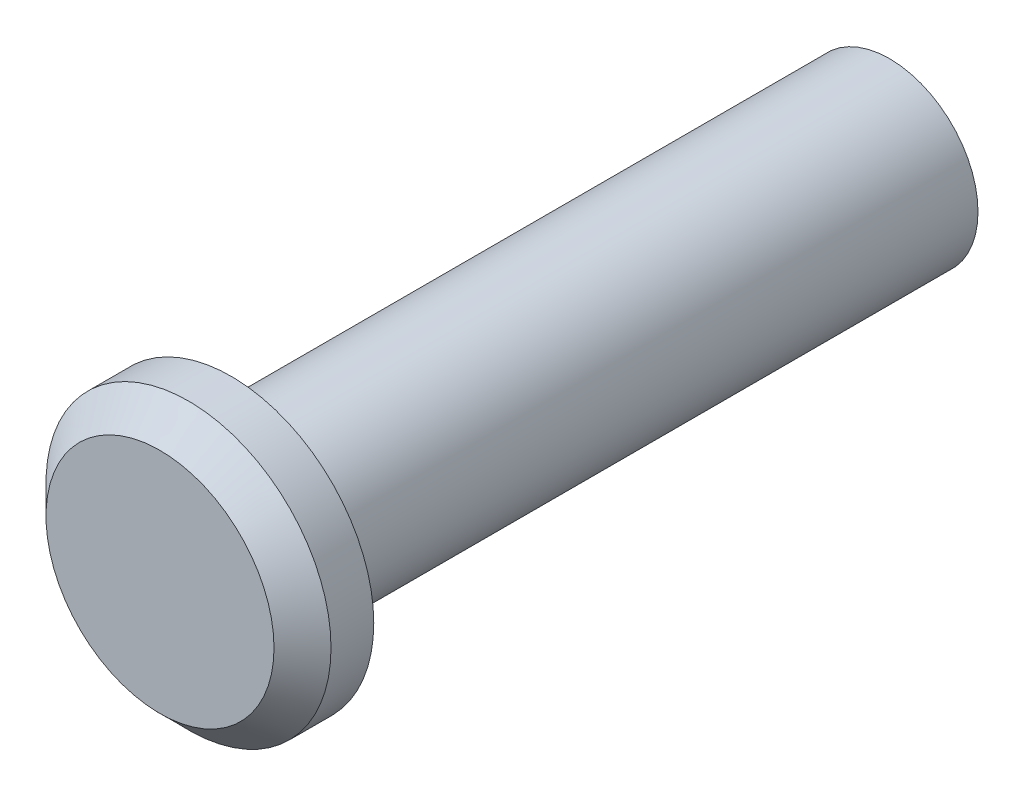
ISO-10303-21;
HEADER;
FILE_DESCRIPTION(('STEP AP214'),'2;1');
FILE_NAME('part.step','',(''),(''),'','','');
FILE_SCHEMA(('AUTOMOTIVE_DESIGN { 1 0 10303 214 1 1 1 1 }'));
ENDSEC;
DATA;
#1=APPLICATION_CONTEXT('core data for automotive mechanical design processes');
#2=APPLICATION_PROTOCOL_DEFINITION('international standard','automotive_design',2000,#1);
#3=PRODUCT_CONTEXT('',#1,'mechanical');
#4=PRODUCT('Part','Part','',(#3));
#5=PRODUCT_RELATED_PRODUCT_CATEGORY('part','',(#4));
#6=PRODUCT_DEFINITION_FORMATION('','',#4);
#7=PRODUCT_DEFINITION_CONTEXT('part definition',#1,'design');
#8=PRODUCT_DEFINITION('design','',#6,#7);
#9=PRODUCT_DEFINITION_SHAPE('','',#8);
#10=(LENGTH_UNIT() NAMED_UNIT(*) SI_UNIT(.MILLI.,.METRE.));
#11=(NAMED_UNIT(*) PLANE_ANGLE_UNIT() SI_UNIT($,.RADIAN.));
#12=(NAMED_UNIT(*) SI_UNIT($,.STERADIAN.) SOLID_ANGLE_UNIT());
#13=UNCERTAINTY_MEASURE_WITH_UNIT(LENGTH_MEASURE(1.E-05),#10,'distance_accuracy_value','');
#14=(GEOMETRIC_REPRESENTATION_CONTEXT(3) GLOBAL_UNCERTAINTY_ASSIGNED_CONTEXT((#13)) GLOBAL_UNIT_ASSIGNED_CONTEXT((#10,
#11,#12)) REPRESENTATION_CONTEXT('',''));
#15=CARTESIAN_POINT('',(0.,0.,0.));
#16=DIRECTION('',(0.,0.,1.));
#17=DIRECTION('',(1.,0.,0.));
#18=AXIS2_PLACEMENT_3D('',#15,#16,#17);
#19=CARTESIAN_POINT('',(0.,0.,-65.024));
#20=DIRECTION('',(0.,0.,1.));
#21=DIRECTION('',(1.,0.,0.));
#22=AXIS2_PLACEMENT_3D('',#19,#20,#21);
#23=CYLINDRICAL_SURFACE('',#22,7.874);
#24=CARTESIAN_POINT('',(0.,0.,-65.024));
#25=DIRECTION('',(0.,0.,1.));
#26=DIRECTION('',(1.,0.,0.));
#27=AXIS2_PLACEMENT_3D('',#24,#25,#26);
#28=CIRCLE('',#27,7.874);
#29=CARTESIAN_POINT('',(7.874,0.,-65.024));
#30=VERTEX_POINT('',#29);
#31=EDGE_CURVE('E42',#30,#30,#28,.T.);
#32=ORIENTED_EDGE('',*,*,#31,.T.);
#33=EDGE_LOOP('',(#32));
#34=FACE_BOUND('',#33,.T.);
#35=CARTESIAN_POINT('',(0.,0.,-6.35));
#36=DIRECTION('',(0.,0.,1.));
#37=DIRECTION('',(1.,0.,0.));
#38=AXIS2_PLACEMENT_3D('',#35,#36,#37);
#39=CIRCLE('',#38,7.874);
#40=CARTESIAN_POINT('',(7.874,0.,-6.35));
#41=VERTEX_POINT('',#40);
#42=EDGE_CURVE('E46',#41,#41,#39,.F.);
#43=ORIENTED_EDGE('',*,*,#42,.T.);
#44=EDGE_LOOP('',(#43));
#45=FACE_BOUND('',#44,.T.);
#46=ADVANCED_FACE('F31',(#34,#45),#23,.T.);
#47=CARTESIAN_POINT('',(0.,0.,-65.024));
#48=DIRECTION('',(0.,0.,1.));
#49=DIRECTION('',(1.,0.,0.));
#50=AXIS2_PLACEMENT_3D('',#47,#48,#49);
#51=PLANE('',#50);
#52=ORIENTED_EDGE('',*,*,#31,.F.);
#53=EDGE_LOOP('',(#52));
#54=FACE_BOUND('',#53,.T.);
#55=ADVANCED_FACE('F67',(#54),#51,.F.);
#56=CARTESIAN_POINT('',(0.,0.,-6.35));
#57=DIRECTION('',(0.,0.,1.));
#58=DIRECTION('',(1.,0.,0.));
#59=AXIS2_PLACEMENT_3D('',#56,#57,#58);
#60=CYLINDRICAL_SURFACE('',#59,12.7);
#61=CARTESIAN_POINT('',(0.,0.,-2.54000000000001));
#62=DIRECTION('',(0.,0.,1.));
#63=DIRECTION('',(1.,0.,0.));
#64=AXIS2_PLACEMENT_3D('',#61,#62,#63);
#65=CIRCLE('',#64,12.7);
#66=CARTESIAN_POINT('',(12.7,0.,-2.54000000000001));
#67=VERTEX_POINT('',#66);
#68=EDGE_CURVE('E10',#67,#67,#65,.F.);
#69=ORIENTED_EDGE('',*,*,#68,.T.);
#70=EDGE_LOOP('',(#69));
#71=FACE_BOUND('',#70,.T.);
#72=CARTESIAN_POINT('',(0.,0.,-6.35));
#73=DIRECTION('',(0.,0.,1.));
#74=DIRECTION('',(1.,0.,0.));
#75=AXIS2_PLACEMENT_3D('',#72,#73,#74);
#76=CIRCLE('',#75,12.7);
#77=CARTESIAN_POINT('',(12.7,0.,-6.35));
#78=VERTEX_POINT('',#77);
#79=EDGE_CURVE('E50',#78,#78,#76,.T.);
#80=ORIENTED_EDGE('',*,*,#79,.T.);
#81=EDGE_LOOP('',(#80));
#82=FACE_BOUND('',#81,.T.);
#83=ADVANCED_FACE('F55',(#71,#82),#60,.T.);
#84=CARTESIAN_POINT('',(0.,0.,-6.35));
#85=DIRECTION('',(0.,0.,1.));
#86=DIRECTION('',(1.,0.,0.));
#87=AXIS2_PLACEMENT_3D('',#84,#85,#86);
#88=PLANE('',#87);
#89=ORIENTED_EDGE('',*,*,#42,.F.);
#90=EDGE_LOOP('',(#89));
#91=FACE_BOUND('',#90,.T.);
#92=ORIENTED_EDGE('',*,*,#79,.F.);
#93=EDGE_LOOP('',(#92));
#94=FACE_BOUND('',#93,.T.);
#95=ADVANCED_FACE('F57',(#91,#94),#88,.F.);
#96=CARTESIAN_POINT('',(0.,0.,0.));
#97=DIRECTION('',(0.,0.,1.));
#98=DIRECTION('',(1.,0.,0.));
#99=AXIS2_PLACEMENT_3D('',#96,#97,#98);
#100=PLANE('',#99);
#101=CARTESIAN_POINT('',(0.,0.,0.));
#102=DIRECTION('',(0.,0.,1.));
#103=DIRECTION('',(1.,0.,0.));
#104=AXIS2_PLACEMENT_3D('',#101,#102,#103);
#105=CIRCLE('',#104,10.16);
#106=CARTESIAN_POINT('',(10.16,0.,0.));
#107=VERTEX_POINT('',#106);
#108=EDGE_CURVE('E38',#107,#107,#105,.T.);
#109=ORIENTED_EDGE('',*,*,#108,.T.);
#110=EDGE_LOOP('',(#109));
#111=FACE_BOUND('',#110,.T.);
#112=ADVANCED_FACE('F59',(#111),#100,.T.);
#113=CARTESIAN_POINT('',(0.,0.,0.));
#114=DIRECTION('',(0.,0.,-1.));
#115=DIRECTION('',(-1.,0.,0.));
#116=AXIS2_PLACEMENT_3D('',#113,#114,#115);
#117=CONICAL_SURFACE('',#116,10.16,0.785398163397447);
#118=ORIENTED_EDGE('',*,*,#68,.F.);
#119=EDGE_LOOP('',(#118));
#120=FACE_BOUND('',#119,.T.);
#121=ORIENTED_EDGE('',*,*,#108,.F.);
#122=EDGE_LOOP('',(#121));
#123=FACE_BOUND('',#122,.T.);
#124=ADVANCED_FACE('F33',(#120,#123),#117,.T.);
#125=CLOSED_SHELL('',(#46,#55,#83,#95,#112,#124));
#126=MANIFOLD_SOLID_BREP('B2',#125);
#127=ADVANCED_BREP_SHAPE_REPRESENTATION('',(#18,#126),#14);
#128=SHAPE_DEFINITION_REPRESENTATION(#9,#127);
ENDSEC;
END-ISO-10303-21;
